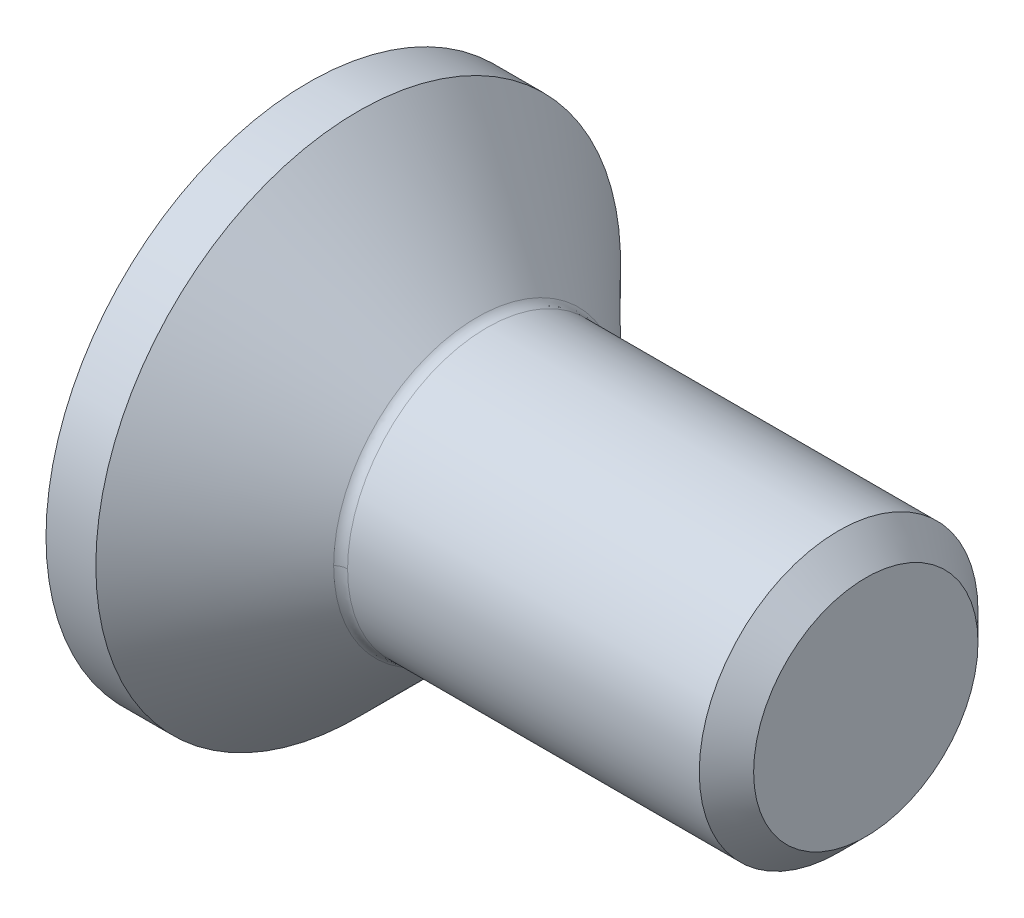
ISO-10303-21;
HEADER;
FILE_DESCRIPTION(('STEP AP214'),'2;1');
FILE_NAME('part.step','',(''),(''),'','','');
FILE_SCHEMA(('AUTOMOTIVE_DESIGN { 1 0 10303 214 1 1 1 1 }'));
ENDSEC;
DATA;
#1=APPLICATION_CONTEXT('core data for automotive mechanical design processes');
#2=APPLICATION_PROTOCOL_DEFINITION('international standard','automotive_design',2000,#1);
#3=PRODUCT_CONTEXT('',#1,'mechanical');
#4=PRODUCT('Part','Part','',(#3));
#5=PRODUCT_RELATED_PRODUCT_CATEGORY('part','',(#4));
#6=PRODUCT_DEFINITION_FORMATION('','',#4);
#7=PRODUCT_DEFINITION_CONTEXT('part definition',#1,'design');
#8=PRODUCT_DEFINITION('design','',#6,#7);
#9=PRODUCT_DEFINITION_SHAPE('','',#8);
#10=(LENGTH_UNIT() NAMED_UNIT(*) SI_UNIT(.MILLI.,.METRE.));
#11=(NAMED_UNIT(*) PLANE_ANGLE_UNIT() SI_UNIT($,.RADIAN.));
#12=(NAMED_UNIT(*) SI_UNIT($,.STERADIAN.) SOLID_ANGLE_UNIT());
#13=UNCERTAINTY_MEASURE_WITH_UNIT(LENGTH_MEASURE(1.E-05),#10,'distance_accuracy_value','');
#14=(GEOMETRIC_REPRESENTATION_CONTEXT(3) GLOBAL_UNCERTAINTY_ASSIGNED_CONTEXT((#13)) GLOBAL_UNIT_ASSIGNED_CONTEXT((#10,
#11,#12)) REPRESENTATION_CONTEXT('',''));
#15=CARTESIAN_POINT('',(0.,0.,0.));
#16=DIRECTION('',(0.,0.,1.));
#17=DIRECTION('',(1.,0.,0.));
#18=AXIS2_PLACEMENT_3D('',#15,#16,#17);
#19=CARTESIAN_POINT('',(8.,-1.62932,1.62932));
#20=DIRECTION('',(1.,0.,0.));
#21=DIRECTION('',(0.,0.,-1.));
#22=AXIS2_PLACEMENT_3D('',#19,#20,#21);
#23=PLANE('',#22);
#24=CARTESIAN_POINT('',(8.00000000000001,0.,0.));
#25=DIRECTION('',(-1.,0.,0.));
#26=DIRECTION('',(0.,0.,1.));
#27=AXIS2_PLACEMENT_3D('',#24,#25,#26);
#28=CIRCLE('',#27,1.60999999999999);
#29=CARTESIAN_POINT('',(8.00000000000001,0.,1.60999999999999));
#30=VERTEX_POINT('',#29);
#31=EDGE_CURVE('E21',#30,#30,#28,.F.);
#32=ORIENTED_EDGE('',*,*,#31,.T.);
#33=EDGE_LOOP('',(#32));
#34=FACE_BOUND('',#33,.T.);
#35=ADVANCED_FACE('F17',(#34),#23,.T.);
#36=CARTESIAN_POINT('',(8.,0.,0.));
#37=DIRECTION('',(-1.,0.,0.));
#38=DIRECTION('',(0.,0.,1.));
#39=AXIS2_PLACEMENT_3D('',#36,#37,#38);
#40=CONICAL_SURFACE('',#39,1.61,0.785398163397448);
#41=ORIENTED_EDGE('',*,*,#31,.F.);
#42=EDGE_LOOP('',(#41));
#43=FACE_BOUND('',#42,.T.);
#44=CARTESIAN_POINT('',(7.61,0.,0.));
#45=DIRECTION('',(-1.,0.,0.));
#46=DIRECTION('',(0.,0.,1.));
#47=AXIS2_PLACEMENT_3D('',#44,#45,#46);
#48=CIRCLE('',#47,2.);
#49=CARTESIAN_POINT('',(7.61,0.,2.));
#50=VERTEX_POINT('',#49);
#51=EDGE_CURVE('E223',#50,#50,#48,.F.);
#52=ORIENTED_EDGE('',*,*,#51,.T.);
#53=EDGE_LOOP('',(#52));
#54=FACE_BOUND('',#53,.T.);
#55=ADVANCED_FACE('F455',(#43,#54),#40,.T.);
#56=CARTESIAN_POINT('',(7.61,0.,0.));
#57=DIRECTION('',(-1.,0.,0.));
#58=DIRECTION('',(0.,-1.,0.));
#59=AXIS2_PLACEMENT_3D('',#56,#57,#58);
#60=CYLINDRICAL_SURFACE('',#59,2.);
#61=ORIENTED_EDGE('',*,*,#51,.F.);
#62=EDGE_LOOP('',(#61));
#63=FACE_BOUND('',#62,.T.);
#64=CARTESIAN_POINT('',(2.56284271251454,0.,0.));
#65=DIRECTION('',(1.,0.,0.));
#66=DIRECTION('',(0.,0.,-1.));
#67=AXIS2_PLACEMENT_3D('',#64,#65,#66);
#68=CIRCLE('',#67,2.00000000010987);
#69=CARTESIAN_POINT('',(2.56284271238551,-2.05103428515331E-10,-2.00000000008241));
#70=VERTEX_POINT('',#69);
#71=CARTESIAN_POINT('',(2.56284271251395,-8.9793628428733E-11,2.00000000008241));
#72=VERTEX_POINT('',#71);
#73=EDGE_CURVE('E214',#70,#72,#68,.T.);
#74=ORIENTED_EDGE('',*,*,#73,.T.);
#75=CARTESIAN_POINT('',(2.56284271251454,0.,0.));
#76=DIRECTION('',(1.,0.,0.));
#77=DIRECTION('',(0.,0.,-1.));
#78=AXIS2_PLACEMENT_3D('',#75,#76,#77);
#79=CIRCLE('',#78,2.00000000010987);
#80=EDGE_CURVE('E203',#72,#70,#79,.T.);
#81=ORIENTED_EDGE('',*,*,#80,.T.);
#82=EDGE_LOOP('',(#74,#81));
#83=FACE_BOUND('',#82,.T.);
#84=ADVANCED_FACE('F446',(#63,#83),#60,.T.);
#85=CARTESIAN_POINT('',(2.582809396,0.,2.000999167));
#86=CARTESIAN_POINT('',(2.582809396,4.001998334,2.000999167));
#87=CARTESIAN_POINT('',(2.582809396,4.001998334,-2.000999167));
#88=CARTESIAN_POINT('',(2.582809396,0.,-2.000999167));
#89=CARTESIAN_POINT('',(2.514652645,0.,1.994160682));
#90=CARTESIAN_POINT('',(2.514652645,3.988321363,1.994160682));
#91=CARTESIAN_POINT('',(2.514652645,3.988321363,-1.994160682));
#92=CARTESIAN_POINT('',(2.514652645,0.,-1.994160682));
#93=CARTESIAN_POINT('',(2.451367858,0.,2.020374099));
#94=CARTESIAN_POINT('',(2.451367858,4.040748198,2.020374099));
#95=CARTESIAN_POINT('',(2.451367858,4.040748198,-2.020374099));
#96=CARTESIAN_POINT('',(2.451367858,0.,-2.020374099));
#97=CARTESIAN_POINT('',(2.408009297,0.,2.073403739));
#98=CARTESIAN_POINT('',(2.408009297,4.146807477,2.073403739));
#99=CARTESIAN_POINT('',(2.408009297,4.146807477,-2.073403739));
#100=CARTESIAN_POINT('',(2.408009297,0.,-2.073403739));
#101=(BOUNDED_SURFACE() B_SPLINE_SURFACE(3,3,((#85,#86,#87,#88),(#89,#90,#91,#92),(#93,#94,#95,
#96),(#97,#98,#99,#100)),.UNSPECIFIED.,.F.,.F.,.F.) B_SPLINE_SURFACE_WITH_KNOTS((4,4),(4,4),(0.,
1.),(0.,1.),.UNSPECIFIED.) GEOMETRIC_REPRESENTATION_ITEM() RATIONAL_B_SPLINE_SURFACE(((1.,
0.333333333333333,0.333333333333333,1.),(0.920706259011135,0.306902086337045,0.306902086337045,
0.920706259011135),(0.920706259011135,0.306902086337045,0.306902086337045,0.920706259011135),
(1.,0.333333333333333,0.333333333333333,1.))) REPRESENTATION_ITEM('') SURFACE());
#102=CARTESIAN_POINT('',(2.42142135599999,0.,0.));
#103=DIRECTION('',(-1.,0.,0.));
#104=DIRECTION('',(0.,0.,1.));
#105=AXIS2_PLACEMENT_3D('',#102,#103,#104);
#106=CIRCLE('',#105,2.058578644);
#107=CARTESIAN_POINT('',(2.42142135610604,-6.33332306629263E-10,-2.05857864400242));
#108=VERTEX_POINT('',#107);
#109=CARTESIAN_POINT('',(2.4214213560545,-1.84847245850662E-10,2.05857864405396));
#110=VERTEX_POINT('',#109);
#111=EDGE_CURVE('E191',#108,#110,#106,.F.);
#112=CARTESIAN_POINT('',(2.582809396,0.,2.000999167));
#113=CARTESIAN_POINT('',(2.514652645,0.,1.994160682));
#114=CARTESIAN_POINT('',(2.451367858,0.,2.020374099));
#115=CARTESIAN_POINT('',(2.408009297,0.,2.073403739));
#116=(BOUNDED_CURVE() B_SPLINE_CURVE(3,(#112,#113,#114,#115),.UNSPECIFIED.,.F.,
.F.) B_SPLINE_CURVE_WITH_KNOTS((4,4),(0.,1.),
.UNSPECIFIED.) CURVE() GEOMETRIC_REPRESENTATION_ITEM() RATIONAL_B_SPLINE_CURVE((1.,
0.920706259011135,0.920706259011135,1.)) REPRESENTATION_ITEM(''));
#117=EDGE_CURVE('E208',#110,#72,#116,.F.);
#118=CARTESIAN_POINT('',(2.582809396,0.,-2.000999167));
#119=CARTESIAN_POINT('',(2.514652645,0.,-1.994160682));
#120=CARTESIAN_POINT('',(2.451367858,0.,-2.020374099));
#121=CARTESIAN_POINT('',(2.408009297,0.,-2.073403739));
#122=(BOUNDED_CURVE() B_SPLINE_CURVE(3,(#118,#119,#120,#121),.UNSPECIFIED.,.F.,
.F.) B_SPLINE_CURVE_WITH_KNOTS((4,4),(0.,1.),
.UNSPECIFIED.) CURVE() GEOMETRIC_REPRESENTATION_ITEM() RATIONAL_B_SPLINE_CURVE((1.,
0.920706259011135,0.920706259011135,1.)) REPRESENTATION_ITEM(''));
#123=EDGE_CURVE('E194',#70,#108,#122,.T.);
#124=ORIENTED_EDGE('',*,*,#111,.T.);
#125=ORIENTED_EDGE('',*,*,#117,.T.);
#126=ORIENTED_EDGE('',*,*,#73,.F.);
#127=ORIENTED_EDGE('',*,*,#123,.T.);
#128=EDGE_LOOP('',(#124,#125,#126,#127));
#129=FACE_BOUND('',#128,.T.);
#130=ADVANCED_FACE('F437',(#129),#101,.F.);
#131=CARTESIAN_POINT('',(2.582809396,0.,-2.000999167));
#132=CARTESIAN_POINT('',(2.582809396,-4.001998334,-2.000999167));
#133=CARTESIAN_POINT('',(2.582809396,-4.001998334,2.000999167));
#134=CARTESIAN_POINT('',(2.582809396,0.,2.000999167));
#135=CARTESIAN_POINT('',(2.514652645,0.,-1.994160682));
#136=CARTESIAN_POINT('',(2.514652645,-3.988321363,-1.994160682));
#137=CARTESIAN_POINT('',(2.514652645,-3.988321363,1.994160682));
#138=CARTESIAN_POINT('',(2.514652645,0.,1.994160682));
#139=CARTESIAN_POINT('',(2.451367858,0.,-2.020374099));
#140=CARTESIAN_POINT('',(2.451367858,-4.040748198,-2.020374099));
#141=CARTESIAN_POINT('',(2.451367858,-4.040748198,2.020374099));
#142=CARTESIAN_POINT('',(2.451367858,0.,2.020374099));
#143=CARTESIAN_POINT('',(2.408009297,0.,-2.073403739));
#144=CARTESIAN_POINT('',(2.408009297,-4.146807477,-2.073403739));
#145=CARTESIAN_POINT('',(2.408009297,-4.146807477,2.073403739));
#146=CARTESIAN_POINT('',(2.408009297,0.,2.073403739));
#147=(BOUNDED_SURFACE() B_SPLINE_SURFACE(3,3,((#131,#132,#133,#134),(#135,#136,#137,#138),(#139,
#140,#141,#142),(#143,#144,#145,#146)),.UNSPECIFIED.,.F.,.F.,
.F.) B_SPLINE_SURFACE_WITH_KNOTS((4,4),(4,4),(0.,1.),(0.,1.),
.UNSPECIFIED.) GEOMETRIC_REPRESENTATION_ITEM() RATIONAL_B_SPLINE_SURFACE(((1.,0.333333333333333,
0.333333333333333,1.),(0.920706259011135,0.306902086337045,0.306902086337045,0.920706259011135),
(0.920706259011135,0.306902086337045,0.306902086337045,0.920706259011135),(1.,0.333333333333333,
0.333333333333333,1.))) REPRESENTATION_ITEM('') SURFACE());
#148=CARTESIAN_POINT('',(2.42142135599999,0.,0.));
#149=DIRECTION('',(-1.,0.,0.));
#150=DIRECTION('',(0.,0.,1.));
#151=AXIS2_PLACEMENT_3D('',#148,#149,#150);
#152=CIRCLE('',#151,2.058578644);
#153=EDGE_CURVE('E190',#110,#108,#152,.F.);
#154=ORIENTED_EDGE('',*,*,#123,.F.);
#155=ORIENTED_EDGE('',*,*,#80,.F.);
#156=ORIENTED_EDGE('',*,*,#117,.F.);
#157=ORIENTED_EDGE('',*,*,#153,.T.);
#158=EDGE_LOOP('',(#154,#155,#156,#157));
#159=FACE_BOUND('',#158,.T.);
#160=ADVANCED_FACE('F268',(#159),#147,.F.);
#161=CARTESIAN_POINT('',(2.421421356,0.,0.));
#162=DIRECTION('',(-1.,0.,0.));
#163=DIRECTION('',(0.,0.,1.));
#164=AXIS2_PLACEMENT_3D('',#161,#162,#163);
#165=CONICAL_SURFACE('',#164,2.058578644,0.785398163397448);
#166=ORIENTED_EDGE('',*,*,#153,.F.);
#167=ORIENTED_EDGE('',*,*,#111,.F.);
#168=EDGE_LOOP('',(#166,#167));
#169=FACE_BOUND('',#168,.T.);
#170=CARTESIAN_POINT('',(0.715,0.,0.));
#171=DIRECTION('',(-1.,0.,0.));
#172=DIRECTION('',(0.,0.,1.));
#173=AXIS2_PLACEMENT_3D('',#170,#171,#172);
#174=CIRCLE('',#173,3.765);
#175=CARTESIAN_POINT('',(0.715,0.,3.765));
#176=VERTEX_POINT('',#175);
#177=EDGE_CURVE('E176',#176,#176,#174,.F.);
#178=ORIENTED_EDGE('',*,*,#177,.T.);
#179=EDGE_LOOP('',(#178));
#180=FACE_BOUND('',#179,.T.);
#181=ADVANCED_FACE('F257',(#169,#180),#165,.T.);
#182=CARTESIAN_POINT('',(0.715,0.,0.));
#183=DIRECTION('',(-1.,0.,0.));
#184=DIRECTION('',(0.,0.,1.));
#185=AXIS2_PLACEMENT_3D('',#182,#183,#184);
#186=CYLINDRICAL_SURFACE('',#185,3.765);
#187=ORIENTED_EDGE('',*,*,#177,.F.);
#188=EDGE_LOOP('',(#187));
#189=FACE_BOUND('',#188,.T.);
#190=CARTESIAN_POINT('',(0.,0.,0.));
#191=DIRECTION('',(-1.,0.,0.));
#192=DIRECTION('',(0.,0.,1.));
#193=AXIS2_PLACEMENT_3D('',#190,#191,#192);
#194=CIRCLE('',#193,3.765);
#195=CARTESIAN_POINT('',(0.,0.,3.765));
#196=VERTEX_POINT('',#195);
#197=EDGE_CURVE('E108',#196,#196,#194,.T.);
#198=ORIENTED_EDGE('',*,*,#197,.F.);
#199=EDGE_LOOP('',(#198));
#200=FACE_BOUND('',#199,.T.);
#201=ADVANCED_FACE('F254',(#189,#200),#186,.T.);
#202=CARTESIAN_POINT('',(0.,-0.721687836,-1.25));
#203=DIRECTION('',(0.,0.,1.));
#204=DIRECTION('',(1.,0.,0.));
#205=AXIS2_PLACEMENT_3D('',#202,#203,#204);
#206=PLANE('',#205);
#207=DIRECTION('',(0.,1.,0.));
#208=VECTOR('',#207,1.);
#209=CARTESIAN_POINT('',(1.5,0.,-1.25));
#210=LINE('',#209,#208);
#211=CARTESIAN_POINT('',(1.5,-2.56379285644164E-10,-1.25));
#212=VERTEX_POINT('',#211);
#213=CARTESIAN_POINT('',(1.5,0.721687836,-1.25));
#214=VERTEX_POINT('',#213);
#215=EDGE_CURVE('E167',#212,#214,#210,.T.);
#216=ORIENTED_EDGE('',*,*,#215,.T.);
#217=DIRECTION('',(1.,0.,0.));
#218=VECTOR('',#217,1.);
#219=CARTESIAN_POINT('',(0.75,0.721687836,-1.25));
#220=LINE('',#219,#218);
#221=CARTESIAN_POINT('',(0.,0.721687837898881,-1.24999999942115));
#222=VERTEX_POINT('',#221);
#223=EDGE_CURVE('E164',#222,#214,#220,.T.);
#224=ORIENTED_EDGE('',*,*,#223,.F.);
#225=DIRECTION('',(0.,1.,0.));
#226=VECTOR('',#225,1.);
#227=CARTESIAN_POINT('',(0.,0.,-1.2499999992282));
#228=LINE('',#227,#226);
#229=CARTESIAN_POINT('',(0.,-0.72168783789888,-1.24999999942115));
#230=VERTEX_POINT('',#229);
#231=EDGE_CURVE('E107',#230,#222,#228,.T.);
#232=ORIENTED_EDGE('',*,*,#231,.F.);
#233=DIRECTION('',(-1.,0.,0.));
#234=VECTOR('',#233,1.);
#235=CARTESIAN_POINT('',(0.75,-0.721687836,-1.25));
#236=LINE('',#235,#234);
#237=CARTESIAN_POINT('',(1.5,-0.721687836,-1.25));
#238=VERTEX_POINT('',#237);
#239=EDGE_CURVE('E103',#238,#230,#236,.T.);
#240=ORIENTED_EDGE('',*,*,#239,.F.);
#241=DIRECTION('',(0.,1.,0.));
#242=VECTOR('',#241,1.);
#243=CARTESIAN_POINT('',(1.5,0.,-1.25));
#244=LINE('',#243,#242);
#245=EDGE_CURVE('E174',#238,#212,#244,.T.);
#246=ORIENTED_EDGE('',*,*,#245,.T.);
#247=EDGE_LOOP('',(#216,#224,#232,#240,#246));
#248=FACE_BOUND('',#247,.T.);
#249=ADVANCED_FACE('F256',(#248),#206,.T.);
#250=CARTESIAN_POINT('',(0.,1.443375673,0.));
#251=DIRECTION('',(0.,-0.866025403630548,0.500000000266546));
#252=DIRECTION('',(0.,-0.500000000266546,-0.866025403630548));
#253=AXIS2_PLACEMENT_3D('',#250,#251,#252);
#254=PLANE('',#253);
#255=DIRECTION('',(0.,0.500000000266546,0.866025403630548));
#256=VECTOR('',#255,1.);
#257=CARTESIAN_POINT('',(1.5,1.0825317545,-0.625));
#258=LINE('',#257,#256);
#259=CARTESIAN_POINT('',(1.5,1.08253175467078,-0.624999999903853));
#260=VERTEX_POINT('',#259);
#261=CARTESIAN_POINT('',(1.5,1.44337567285065,-2.58679525282773E-10));
#262=VERTEX_POINT('',#261);
#263=EDGE_CURVE('E157',#260,#262,#258,.T.);
#264=ORIENTED_EDGE('',*,*,#263,.T.);
#265=DIRECTION('',(1.,0.,0.));
#266=VECTOR('',#265,1.);
#267=CARTESIAN_POINT('',(0.75,1.443375673,0.));
#268=LINE('',#267,#266);
#269=CARTESIAN_POINT('',(0.,1.44337567274379,4.43768801003039E-10));
#270=VERTEX_POINT('',#269);
#271=EDGE_CURVE('E126',#270,#262,#268,.T.);
#272=ORIENTED_EDGE('',*,*,#271,.F.);
#273=DIRECTION('',(0.,0.499999997992189,0.866025404943649));
#274=VECTOR('',#273,1.);
#275=CARTESIAN_POINT('',(0.,0.721687839797762,-1.2499999992282));
#276=LINE('',#275,#274);
#277=EDGE_CURVE('E148',#222,#270,#276,.T.);
#278=ORIENTED_EDGE('',*,*,#277,.F.);
#279=ORIENTED_EDGE('',*,*,#223,.T.);
#280=DIRECTION('',(0.,0.500000000266546,0.866025403630548));
#281=VECTOR('',#280,1.);
#282=CARTESIAN_POINT('',(1.5,1.0825317545,-0.625));
#283=LINE('',#282,#281);
#284=EDGE_CURVE('E163',#214,#260,#283,.T.);
#285=ORIENTED_EDGE('',*,*,#284,.T.);
#286=EDGE_LOOP('',(#264,#272,#278,#279,#285));
#287=FACE_BOUND('',#286,.T.);
#288=ADVANCED_FACE('F265',(#287),#254,.T.);
#289=CARTESIAN_POINT('',(0.,-0.721687836,-1.25));
#290=DIRECTION('',(0.,0.866025403630548,0.500000000266546));
#291=DIRECTION('',(0.,-0.500000000266546,0.866025403630548));
#292=AXIS2_PLACEMENT_3D('',#289,#290,#291);
#293=PLANE('',#292);
#294=DIRECTION('',(0.,0.500000000266546,-0.866025403630548));
#295=VECTOR('',#294,1.);
#296=CARTESIAN_POINT('',(1.5,-1.0825317545,-0.625));
#297=LINE('',#296,#295);
#298=CARTESIAN_POINT('',(1.5,-1.08253175461466,-0.625000000001057));
#299=VERTEX_POINT('',#298);
#300=EDGE_CURVE('E156',#299,#238,#297,.T.);
#301=ORIENTED_EDGE('',*,*,#300,.T.);
#302=ORIENTED_EDGE('',*,*,#239,.T.);
#303=DIRECTION('',(0.,0.499999997992189,-0.866025404943649));
#304=VECTOR('',#303,1.);
#305=CARTESIAN_POINT('',(0.,-1.44337567197516,0.));
#306=LINE('',#305,#304);
#307=CARTESIAN_POINT('',(0.,-1.44337567274379,4.43769365015375E-10));
#308=VERTEX_POINT('',#307);
#309=EDGE_CURVE('E98',#308,#230,#306,.T.);
#310=ORIENTED_EDGE('',*,*,#309,.F.);
#311=DIRECTION('',(-1.,0.,0.));
#312=VECTOR('',#311,1.);
#313=CARTESIAN_POINT('',(0.75,-1.443375673,0.));
#314=LINE('',#313,#312);
#315=CARTESIAN_POINT('',(1.5,-1.44337567294109,-1.02042940069991E-10));
#316=VERTEX_POINT('',#315);
#317=EDGE_CURVE('E101',#316,#308,#314,.T.);
#318=ORIENTED_EDGE('',*,*,#317,.F.);
#319=DIRECTION('',(0.,0.500000000266546,-0.866025403630548));
#320=VECTOR('',#319,1.);
#321=CARTESIAN_POINT('',(1.5,-1.0825317545,-0.625));
#322=LINE('',#321,#320);
#323=EDGE_CURVE('E154',#316,#299,#322,.T.);
#324=ORIENTED_EDGE('',*,*,#323,.T.);
#325=EDGE_LOOP('',(#301,#302,#310,#318,#324));
#326=FACE_BOUND('',#325,.T.);
#327=ADVANCED_FACE('F100',(#326),#293,.T.);
#328=CARTESIAN_POINT('',(0.,-3.81018,-3.81018));
#329=DIRECTION('',(-1.,0.,0.));
#330=DIRECTION('',(0.,0.,1.));
#331=AXIS2_PLACEMENT_3D('',#328,#329,#330);
#332=PLANE('',#331);
#333=DIRECTION('',(0.,0.500000000266546,-0.866025403630548));
#334=VECTOR('',#333,1.);
#335=CARTESIAN_POINT('',(0.,1.0825317545,0.625));
#336=LINE('',#335,#334);
#337=CARTESIAN_POINT('',(0.,0.721687836,1.25));
#338=VERTEX_POINT('',#337);
#339=EDGE_CURVE('E130',#338,#270,#336,.T.);
#340=ORIENTED_EDGE('',*,*,#339,.F.);
#341=DIRECTION('',(0.,1.,0.));
#342=VECTOR('',#341,1.);
#343=CARTESIAN_POINT('',(0.,0.,1.25));
#344=LINE('',#343,#342);
#345=CARTESIAN_POINT('',(0.,-0.721687836,1.25));
#346=VERTEX_POINT('',#345);
#347=EDGE_CURVE('E124',#346,#338,#344,.T.);
#348=ORIENTED_EDGE('',*,*,#347,.F.);
#349=DIRECTION('',(0.,0.500000000266546,0.866025403630548));
#350=VECTOR('',#349,1.);
#351=CARTESIAN_POINT('',(0.,-1.0825317545,0.625));
#352=LINE('',#351,#350);
#353=EDGE_CURVE('E113',#308,#346,#352,.T.);
#354=ORIENTED_EDGE('',*,*,#353,.F.);
#355=ORIENTED_EDGE('',*,*,#309,.T.);
#356=ORIENTED_EDGE('',*,*,#231,.T.);
#357=ORIENTED_EDGE('',*,*,#277,.T.);
#358=EDGE_LOOP('',(#340,#348,#354,#355,#356,#357));
#359=FACE_BOUND('',#358,.T.);
#360=ORIENTED_EDGE('',*,*,#197,.T.);
#361=EDGE_LOOP('',(#360));
#362=FACE_BOUND('',#361,.T.);
#363=ADVANCED_FACE('F122',(#359,#362),#332,.T.);
#364=CARTESIAN_POINT('',(0.,0.721687836,1.25));
#365=DIRECTION('',(0.,-0.866025403630548,-0.500000000266546));
#366=DIRECTION('',(0.,0.500000000266546,-0.866025403630548));
#367=AXIS2_PLACEMENT_3D('',#364,#365,#366);
#368=PLANE('',#367);
#369=DIRECTION('',(0.,0.499999999995552,-0.866025403787006));
#370=VECTOR('',#369,1.);
#371=CARTESIAN_POINT('',(1.5,0.721687836067296,1.25));
#372=LINE('',#371,#370);
#373=CARTESIAN_POINT('',(1.5,0.721687836033648,1.25));
#374=VERTEX_POINT('',#373);
#375=CARTESIAN_POINT('',(1.5,1.08253175444642,0.624999999854609));
#376=VERTEX_POINT('',#375);
#377=EDGE_CURVE('E118',#374,#376,#372,.T.);
#378=ORIENTED_EDGE('',*,*,#377,.F.);
#379=DIRECTION('',(1.,0.,0.));
#380=VECTOR('',#379,1.);
#381=CARTESIAN_POINT('',(0.75,0.721687836,1.25));
#382=LINE('',#381,#380);
#383=EDGE_CURVE('E138',#338,#374,#382,.T.);
#384=ORIENTED_EDGE('',*,*,#383,.F.);
#385=ORIENTED_EDGE('',*,*,#339,.T.);
#386=ORIENTED_EDGE('',*,*,#271,.T.);
#387=DIRECTION('',(0.,0.4999999997305,-0.866025403940035));
#388=VECTOR('',#387,1.);
#389=CARTESIAN_POINT('',(1.5,1.08253175459739,0.62499999969));
#390=LINE('',#389,#388);
#391=EDGE_CURVE('E139',#376,#262,#390,.T.);
#392=ORIENTED_EDGE('',*,*,#391,.F.);
#393=EDGE_LOOP('',(#378,#384,#385,#386,#392));
#394=FACE_BOUND('',#393,.T.);
#395=ADVANCED_FACE('F296',(#394),#368,.T.);
#396=CARTESIAN_POINT('',(0.,-1.443375673,0.));
#397=DIRECTION('',(0.,0.866025403630548,-0.500000000266546));
#398=DIRECTION('',(0.,0.500000000266546,0.866025403630548));
#399=AXIS2_PLACEMENT_3D('',#396,#397,#398);
#400=PLANE('',#399);
#401=DIRECTION('',(0.,-0.500000000266546,-0.866025403630548));
#402=VECTOR('',#401,1.);
#403=CARTESIAN_POINT('',(1.5,-1.0825317545,0.625));
#404=LINE('',#403,#402);
#405=CARTESIAN_POINT('',(1.5,-1.0825317545426,0.625000000125883));
#406=VERTEX_POINT('',#405);
#407=EDGE_CURVE('E116',#406,#316,#404,.T.);
#408=ORIENTED_EDGE('',*,*,#407,.T.);
#409=ORIENTED_EDGE('',*,*,#317,.T.);
#410=ORIENTED_EDGE('',*,*,#353,.T.);
#411=DIRECTION('',(-1.,0.,0.));
#412=VECTOR('',#411,1.);
#413=CARTESIAN_POINT('',(0.75,-0.721687836,1.25));
#414=LINE('',#413,#412);
#415=CARTESIAN_POINT('',(1.5,-0.721687836022432,1.25));
#416=VERTEX_POINT('',#415);
#417=EDGE_CURVE('E247',#416,#346,#414,.T.);
#418=ORIENTED_EDGE('',*,*,#417,.F.);
#419=DIRECTION('',(0.,-0.500000000266546,-0.866025403630548));
#420=VECTOR('',#419,1.);
#421=CARTESIAN_POINT('',(1.5,-1.0825317545,0.625));
#422=LINE('',#421,#420);
#423=EDGE_CURVE('E125',#416,#406,#422,.T.);
#424=ORIENTED_EDGE('',*,*,#423,.T.);
#425=EDGE_LOOP('',(#408,#409,#410,#418,#424));
#426=FACE_BOUND('',#425,.T.);
#427=ADVANCED_FACE('F111',(#426),#400,.T.);
#428=CARTESIAN_POINT('',(1.5,-0.006495191,0.62125));
#429=DIRECTION('',(-1.,0.,0.));
#430=DIRECTION('',(0.,0.,1.));
#431=AXIS2_PLACEMENT_3D('',#428,#429,#430);
#432=PLANE('',#431);
#433=DIRECTION('',(0.,-1.,0.));
#434=VECTOR('',#433,1.);
#435=CARTESIAN_POINT('',(1.5,0.,1.25));
#436=LINE('',#435,#434);
#437=CARTESIAN_POINT('',(1.5,-1.12242035535916E-10,1.25));
#438=VERTEX_POINT('',#437);
#439=EDGE_CURVE('E143',#374,#438,#436,.T.);
#440=ORIENTED_EDGE('',*,*,#439,.F.);
#441=ORIENTED_EDGE('',*,*,#377,.T.);
#442=CARTESIAN_POINT('',(1.5,0.,0.));
#443=DIRECTION('',(-1.,0.,0.));
#444=DIRECTION('',(0.,0.,1.));
#445=AXIS2_PLACEMENT_3D('',#442,#443,#444);
#446=CIRCLE('',#445,1.25);
#447=EDGE_CURVE('E244',#438,#376,#446,.T.);
#448=ORIENTED_EDGE('',*,*,#447,.F.);
#449=EDGE_LOOP('',(#440,#441,#448));
#450=FACE_BOUND('',#449,.T.);
#451=ADVANCED_FACE('F307',(#450),#432,.T.);
#452=CARTESIAN_POINT('',(1.5,1.080366691,-0.6325));
#453=DIRECTION('',(-1.,0.,0.));
#454=DIRECTION('',(0.,0.,1.));
#455=AXIS2_PLACEMENT_3D('',#452,#453,#454);
#456=PLANE('',#455);
#457=ORIENTED_EDGE('',*,*,#391,.T.);
#458=ORIENTED_EDGE('',*,*,#263,.F.);
#459=CARTESIAN_POINT('',(1.5,0.,0.));
#460=DIRECTION('',(-1.,0.,0.));
#461=DIRECTION('',(0.,0.,1.));
#462=AXIS2_PLACEMENT_3D('',#459,#460,#461);
#463=CIRCLE('',#462,1.25);
#464=EDGE_CURVE('E241',#376,#260,#463,.T.);
#465=ORIENTED_EDGE('',*,*,#464,.F.);
#466=EDGE_LOOP('',(#457,#458,#465));
#467=FACE_BOUND('',#466,.T.);
#468=ADVANCED_FACE('F303',(#467),#456,.T.);
#469=CARTESIAN_POINT('',(1.5,-0.006495191,-1.25));
#470=DIRECTION('',(-1.,0.,0.));
#471=DIRECTION('',(0.,0.,1.));
#472=AXIS2_PLACEMENT_3D('',#469,#470,#471);
#473=PLANE('',#472);
#474=ORIENTED_EDGE('',*,*,#284,.F.);
#475=ORIENTED_EDGE('',*,*,#215,.F.);
#476=CARTESIAN_POINT('',(1.5,0.,0.));
#477=DIRECTION('',(-1.,0.,0.));
#478=DIRECTION('',(0.,0.,1.));
#479=AXIS2_PLACEMENT_3D('',#476,#477,#478);
#480=CIRCLE('',#479,1.25);
#481=EDGE_CURVE('E238',#260,#212,#480,.T.);
#482=ORIENTED_EDGE('',*,*,#481,.F.);
#483=EDGE_LOOP('',(#474,#475,#482));
#484=FACE_BOUND('',#483,.T.);
#485=ADVANCED_FACE('F320',(#484),#473,.T.);
#486=CARTESIAN_POINT('',(1.5,-0.721687836,1.25));
#487=DIRECTION('',(0.,0.,-1.));
#488=DIRECTION('',(-1.,0.,0.));
#489=AXIS2_PLACEMENT_3D('',#486,#487,#488);
#490=PLANE('',#489);
#491=DIRECTION('',(0.,1.,0.));
#492=VECTOR('',#491,1.);
#493=CARTESIAN_POINT('',(1.5,-0.541265877,1.25));
#494=LINE('',#493,#492);
#495=EDGE_CURVE('E237',#416,#438,#494,.T.);
#496=ORIENTED_EDGE('',*,*,#495,.F.);
#497=ORIENTED_EDGE('',*,*,#417,.T.);
#498=ORIENTED_EDGE('',*,*,#347,.T.);
#499=ORIENTED_EDGE('',*,*,#383,.T.);
#500=ORIENTED_EDGE('',*,*,#439,.T.);
#501=EDGE_LOOP('',(#496,#497,#498,#499,#500));
#502=FACE_BOUND('',#501,.T.);
#503=ADVANCED_FACE('F318',(#502),#490,.T.);
#504=CARTESIAN_POINT('',(1.5,-1.089026945,-1.25));
#505=DIRECTION('',(-1.,0.,0.));
#506=DIRECTION('',(0.,0.,1.));
#507=AXIS2_PLACEMENT_3D('',#504,#505,#506);
#508=PLANE('',#507);
#509=ORIENTED_EDGE('',*,*,#245,.F.);
#510=ORIENTED_EDGE('',*,*,#300,.F.);
#511=CARTESIAN_POINT('',(1.5,0.,0.));
#512=DIRECTION('',(-1.,0.,0.));
#513=DIRECTION('',(0.,0.,1.));
#514=AXIS2_PLACEMENT_3D('',#511,#512,#513);
#515=CIRCLE('',#514,1.25);
#516=EDGE_CURVE('E234',#212,#299,#515,.T.);
#517=ORIENTED_EDGE('',*,*,#516,.F.);
#518=EDGE_LOOP('',(#509,#510,#517));
#519=FACE_BOUND('',#518,.T.);
#520=ADVANCED_FACE('F288',(#519),#508,.T.);
#521=CARTESIAN_POINT('',(1.5,-1.445540736,-0.6325));
#522=DIRECTION('',(-1.,0.,0.));
#523=DIRECTION('',(0.,0.,1.));
#524=AXIS2_PLACEMENT_3D('',#521,#522,#523);
#525=PLANE('',#524);
#526=ORIENTED_EDGE('',*,*,#323,.F.);
#527=ORIENTED_EDGE('',*,*,#407,.F.);
#528=CARTESIAN_POINT('',(1.5,0.,0.));
#529=DIRECTION('',(-1.,0.,0.));
#530=DIRECTION('',(0.,0.,1.));
#531=AXIS2_PLACEMENT_3D('',#528,#529,#530);
#532=CIRCLE('',#531,1.25);
#533=EDGE_CURVE('E27',#299,#406,#532,.T.);
#534=ORIENTED_EDGE('',*,*,#533,.F.);
#535=EDGE_LOOP('',(#526,#527,#534));
#536=FACE_BOUND('',#535,.T.);
#537=ADVANCED_FACE('F278',(#536),#525,.T.);
#538=CARTESIAN_POINT('',(1.5,-1.089026945,0.62125));
#539=DIRECTION('',(-1.,0.,0.));
#540=DIRECTION('',(0.,0.,1.));
#541=AXIS2_PLACEMENT_3D('',#538,#539,#540);
#542=PLANE('',#541);
#543=ORIENTED_EDGE('',*,*,#423,.F.);
#544=ORIENTED_EDGE('',*,*,#495,.T.);
#545=CARTESIAN_POINT('',(1.5,0.,0.));
#546=DIRECTION('',(-1.,0.,0.));
#547=DIRECTION('',(0.,0.,1.));
#548=AXIS2_PLACEMENT_3D('',#545,#546,#547);
#549=CIRCLE('',#548,1.25);
#550=EDGE_CURVE('E11',#406,#438,#549,.T.);
#551=ORIENTED_EDGE('',*,*,#550,.F.);
#552=EDGE_LOOP('',(#543,#544,#551));
#553=FACE_BOUND('',#552,.T.);
#554=ADVANCED_FACE('F19',(#553),#542,.T.);
#555=CARTESIAN_POINT('',(2.221687836,0.,0.));
#556=DIRECTION('',(-1.,0.,0.));
#557=DIRECTION('',(0.,0.,1.));
#558=AXIS2_PLACEMENT_3D('',#555,#556,#557);
#559=CONICAL_SURFACE('',#558,0.,1.04719755148882);
#560=CARTESIAN_POINT('',(2.221687836,0.,0.));
#561=VERTEX_POINT('',#560);
#562=VERTEX_LOOP('',#561);
#563=FACE_BOUND('',#562,.T.);
#564=ORIENTED_EDGE('',*,*,#533,.T.);
#565=ORIENTED_EDGE('',*,*,#550,.T.);
#566=ORIENTED_EDGE('',*,*,#447,.T.);
#567=ORIENTED_EDGE('',*,*,#464,.T.);
#568=ORIENTED_EDGE('',*,*,#481,.T.);
#569=ORIENTED_EDGE('',*,*,#516,.T.);
#570=EDGE_LOOP('',(#564,#565,#566,#567,#568,#569));
#571=FACE_BOUND('',#570,.T.);
#572=ADVANCED_FACE('F273',(#563,#571),#559,.F.);
#573=CLOSED_SHELL('',(#35,#55,#84,#130,#160,#181,#201,#249,#288,#327,#363,#395,#427,#451,#468,
#485,#503,#520,#537,#554,#572));
#574=MANIFOLD_SOLID_BREP('B1',#573);
#575=ADVANCED_BREP_SHAPE_REPRESENTATION('',(#18,#574),#14);
#576=SHAPE_DEFINITION_REPRESENTATION(#9,#575);
ENDSEC;
END-ISO-10303-21;
